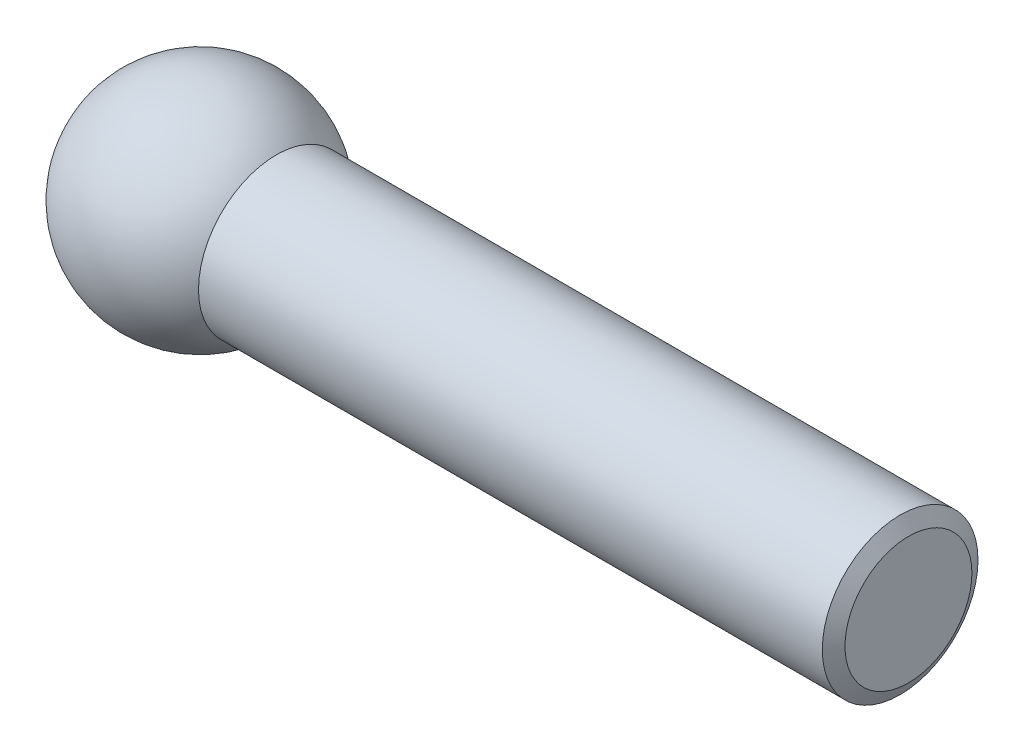
ISO-10303-21;
HEADER;
FILE_DESCRIPTION(('STEP AP214'),'2;1');
FILE_NAME('part.step','',(''),(''),'','','');
FILE_SCHEMA(('AUTOMOTIVE_DESIGN { 1 0 10303 214 1 1 1 1 }'));
ENDSEC;
DATA;
#1=APPLICATION_CONTEXT('core data for automotive mechanical design processes');
#2=APPLICATION_PROTOCOL_DEFINITION('international standard','automotive_design',2000,#1);
#3=PRODUCT_CONTEXT('',#1,'mechanical');
#4=PRODUCT('Part','Part','',(#3));
#5=PRODUCT_RELATED_PRODUCT_CATEGORY('part','',(#4));
#6=PRODUCT_DEFINITION_FORMATION('','',#4);
#7=PRODUCT_DEFINITION_CONTEXT('part definition',#1,'design');
#8=PRODUCT_DEFINITION('design','',#6,#7);
#9=PRODUCT_DEFINITION_SHAPE('','',#8);
#10=(LENGTH_UNIT() NAMED_UNIT(*) SI_UNIT(.MILLI.,.METRE.));
#11=(NAMED_UNIT(*) PLANE_ANGLE_UNIT() SI_UNIT($,.RADIAN.));
#12=(NAMED_UNIT(*) SI_UNIT($,.STERADIAN.) SOLID_ANGLE_UNIT());
#13=UNCERTAINTY_MEASURE_WITH_UNIT(LENGTH_MEASURE(1.E-05),#10,'distance_accuracy_value','');
#14=(GEOMETRIC_REPRESENTATION_CONTEXT(3) GLOBAL_UNCERTAINTY_ASSIGNED_CONTEXT((#13)) GLOBAL_UNIT_ASSIGNED_CONTEXT((#10,
#11,#12)) REPRESENTATION_CONTEXT('',''));
#15=CARTESIAN_POINT('',(0.,0.,0.));
#16=DIRECTION('',(0.,0.,1.));
#17=DIRECTION('',(1.,0.,0.));
#18=AXIS2_PLACEMENT_3D('',#15,#16,#17);
#19=CARTESIAN_POINT('',(130.,0.,0.));
#20=DIRECTION('',(-1.,0.,0.));
#21=DIRECTION('',(0.,0.,1.));
#22=AXIS2_PLACEMENT_3D('',#19,#20,#21);
#23=CYLINDRICAL_SURFACE('',#22,14.2875);
#24=CARTESIAN_POINT('',(128.476,0.,0.));
#25=DIRECTION('',(1.,0.,0.));
#26=DIRECTION('',(0.,0.,-1.));
#27=AXIS2_PLACEMENT_3D('',#24,#25,#26);
#28=CIRCLE('',#27,14.2875);
#29=CARTESIAN_POINT('',(128.476,0.,-14.2875));
#30=VERTEX_POINT('',#29);
#31=EDGE_CURVE('E47',#30,#30,#28,.F.);
#32=ORIENTED_EDGE('',*,*,#31,.T.);
#33=EDGE_LOOP('',(#32));
#34=FACE_BOUND('',#33,.T.);
#35=CARTESIAN_POINT('',(13.9952614748707,0.,0.));
#36=DIRECTION('',(-1.,0.,0.));
#37=DIRECTION('',(0.,0.,1.));
#38=AXIS2_PLACEMENT_3D('',#35,#36,#37);
#39=CIRCLE('',#38,14.2875);
#40=CARTESIAN_POINT('',(13.9952614748707,0.,14.2875));
#41=VERTEX_POINT('',#40);
#42=EDGE_CURVE('E10',#41,#41,#39,.T.);
#43=ORIENTED_EDGE('',*,*,#42,.F.);
#44=EDGE_LOOP('',(#43));
#45=FACE_BOUND('',#44,.T.);
#46=ADVANCED_FACE('F39',(#34,#45),#23,.T.);
#47=CARTESIAN_POINT('',(130.,0.,0.));
#48=DIRECTION('',(1.,0.,0.));
#49=DIRECTION('',(0.,0.,-1.));
#50=AXIS2_PLACEMENT_3D('',#47,#48,#49);
#51=PLANE('',#50);
#52=CARTESIAN_POINT('',(130.,0.,0.));
#53=DIRECTION('',(1.,0.,0.));
#54=DIRECTION('',(0.,0.,-1.));
#55=AXIS2_PLACEMENT_3D('',#52,#53,#54);
#56=CIRCLE('',#55,11.647854569265);
#57=CARTESIAN_POINT('',(130.,0.,-11.647854569265));
#58=VERTEX_POINT('',#57);
#59=EDGE_CURVE('E52',#58,#58,#56,.T.);
#60=ORIENTED_EDGE('',*,*,#59,.T.);
#61=EDGE_LOOP('',(#60));
#62=FACE_BOUND('',#61,.T.);
#63=ADVANCED_FACE('F60',(#62),#51,.T.);
#64=CARTESIAN_POINT('',(130.,0.,0.));
#65=DIRECTION('',(-1.,0.,0.));
#66=DIRECTION('',(0.,0.,1.));
#67=AXIS2_PLACEMENT_3D('',#64,#65,#66);
#68=CONICAL_SURFACE('',#67,11.647854569265,1.0471975511966);
#69=ORIENTED_EDGE('',*,*,#31,.F.);
#70=EDGE_LOOP('',(#69));
#71=FACE_BOUND('',#70,.T.);
#72=ORIENTED_EDGE('',*,*,#59,.F.);
#73=EDGE_LOOP('',(#72));
#74=FACE_BOUND('',#73,.T.);
#75=ADVANCED_FACE('F41',(#71,#74),#68,.T.);
#76=CARTESIAN_POINT('',(0.,0.,0.));
#77=DIRECTION('',(-1.,0.,0.));
#78=DIRECTION('',(0.,-1.,0.));
#79=AXIS2_PLACEMENT_3D('',#76,#77,#78);
#80=SPHERICAL_SURFACE('',#79,20.);
#81=ORIENTED_EDGE('',*,*,#42,.T.);
#82=EDGE_LOOP('',(#81));
#83=FACE_BOUND('',#82,.T.);
#84=ADVANCED_FACE('F63',(#83),#80,.T.);
#85=CLOSED_SHELL('',(#46,#63,#75,#84));
#86=MANIFOLD_SOLID_BREP('B2',#85);
#87=ADVANCED_BREP_SHAPE_REPRESENTATION('',(#18,#86),#14);
#88=SHAPE_DEFINITION_REPRESENTATION(#9,#87);
ENDSEC;
END-ISO-10303-21;
